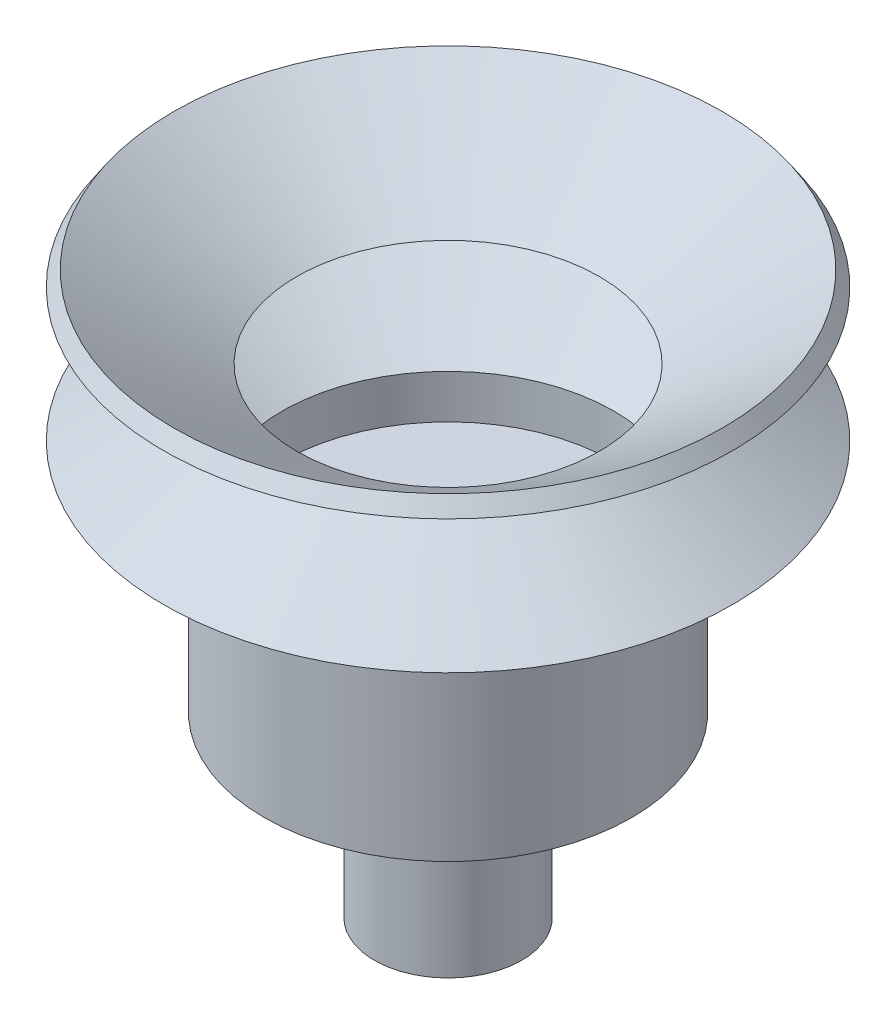
ISO-10303-21;
HEADER;
FILE_DESCRIPTION(('STEP AP214'),'2;1');
FILE_NAME('part.step','',(''),(''),'','','');
FILE_SCHEMA(('AUTOMOTIVE_DESIGN { 1 0 10303 214 1 1 1 1 }'));
ENDSEC;
DATA;
#1=APPLICATION_CONTEXT('core data for automotive mechanical design processes');
#2=APPLICATION_PROTOCOL_DEFINITION('international standard','automotive_design',2000,#1);
#3=PRODUCT_CONTEXT('',#1,'mechanical');
#4=PRODUCT('Part','Part','',(#3));
#5=PRODUCT_RELATED_PRODUCT_CATEGORY('part','',(#4));
#6=PRODUCT_DEFINITION_FORMATION('','',#4);
#7=PRODUCT_DEFINITION_CONTEXT('part definition',#1,'design');
#8=PRODUCT_DEFINITION('design','',#6,#7);
#9=PRODUCT_DEFINITION_SHAPE('','',#8);
#10=(LENGTH_UNIT() NAMED_UNIT(*) SI_UNIT(.MILLI.,.METRE.));
#11=(NAMED_UNIT(*) PLANE_ANGLE_UNIT() SI_UNIT($,.RADIAN.));
#12=(NAMED_UNIT(*) SI_UNIT($,.STERADIAN.) SOLID_ANGLE_UNIT());
#13=UNCERTAINTY_MEASURE_WITH_UNIT(LENGTH_MEASURE(1.E-05),#10,'distance_accuracy_value','');
#14=(GEOMETRIC_REPRESENTATION_CONTEXT(3) GLOBAL_UNCERTAINTY_ASSIGNED_CONTEXT((#13)) GLOBAL_UNIT_ASSIGNED_CONTEXT((#10,
#11,#12)) REPRESENTATION_CONTEXT('',''));
#15=CARTESIAN_POINT('',(0.,0.,0.));
#16=DIRECTION('',(0.,0.,1.));
#17=DIRECTION('',(1.,0.,0.));
#18=AXIS2_PLACEMENT_3D('',#15,#16,#17);
#19=CARTESIAN_POINT('',(0.,0.,0.));
#20=DIRECTION('',(0.,-1.,0.));
#21=DIRECTION('',(0.,0.,-1.));
#22=AXIS2_PLACEMENT_3D('',#19,#20,#21);
#23=PLANE('',#22);
#24=CARTESIAN_POINT('',(0.,0.,0.));
#25=DIRECTION('',(0.,-1.,0.));
#26=DIRECTION('',(0.,0.,-1.));
#27=AXIS2_PLACEMENT_3D('',#24,#25,#26);
#28=CIRCLE('',#27,3.3);
#29=CARTESIAN_POINT('',(0.,0.,-3.3));
#30=VERTEX_POINT('',#29);
#31=EDGE_CURVE('E10',#30,#30,#28,.T.);
#32=ORIENTED_EDGE('',*,*,#31,.F.);
#33=EDGE_LOOP('',(#32));
#34=FACE_BOUND('',#33,.T.);
#35=CARTESIAN_POINT('',(0.,0.,0.));
#36=DIRECTION('',(0.,-1.,0.));
#37=DIRECTION('',(0.,0.,-1.));
#38=AXIS2_PLACEMENT_3D('',#35,#36,#37);
#39=CIRCLE('',#38,8.22712578724926);
#40=CARTESIAN_POINT('',(0.,0.,-8.22712578724926));
#41=VERTEX_POINT('',#40);
#42=EDGE_CURVE('E38',#41,#41,#39,.T.);
#43=ORIENTED_EDGE('',*,*,#42,.T.);
#44=EDGE_LOOP('',(#43));
#45=FACE_BOUND('',#44,.T.);
#46=ADVANCED_FACE('F35',(#34,#45),#23,.T.);
#47=CARTESIAN_POINT('',(0.,0.,0.));
#48=DIRECTION('',(0.,-1.,0.));
#49=DIRECTION('',(0.,0.,-1.));
#50=AXIS2_PLACEMENT_3D('',#47,#48,#49);
#51=CYLINDRICAL_SURFACE('',#50,8.22712578724926);
#52=CARTESIAN_POINT('',(0.,7.51998689008455,0.));
#53=DIRECTION('',(0.,-1.,0.));
#54=DIRECTION('',(0.,0.,-1.));
#55=AXIS2_PLACEMENT_3D('',#52,#53,#54);
#56=CIRCLE('',#55,8.22712578724926);
#57=CARTESIAN_POINT('',(0.,7.51998689008455,-8.22712578724926));
#58=VERTEX_POINT('',#57);
#59=EDGE_CURVE('E46',#58,#58,#56,.T.);
#60=ORIENTED_EDGE('',*,*,#59,.T.);
#61=EDGE_LOOP('',(#60));
#62=FACE_BOUND('',#61,.T.);
#63=ORIENTED_EDGE('',*,*,#42,.F.);
#64=EDGE_LOOP('',(#63));
#65=FACE_BOUND('',#64,.T.);
#66=ADVANCED_FACE('F76',(#62,#65),#51,.T.);
#67=CARTESIAN_POINT('',(0.,7.51998689008455,0.));
#68=DIRECTION('',(0.,1.,0.));
#69=DIRECTION('',(0.,0.,1.));
#70=AXIS2_PLACEMENT_3D('',#67,#68,#69);
#71=CONICAL_SURFACE('',#70,8.22712578724926,0.985110783337746);
#72=CARTESIAN_POINT('',(0.,10.5049492014044,0.));
#73=DIRECTION('',(0.,-1.,0.));
#74=DIRECTION('',(0.,0.,-1.));
#75=AXIS2_PLACEMENT_3D('',#72,#73,#74);
#76=CIRCLE('',#75,12.7271257872493);
#77=CARTESIAN_POINT('',(0.,10.5049492014044,-12.7271257872493));
#78=VERTEX_POINT('',#77);
#79=EDGE_CURVE('E71',#78,#78,#76,.T.);
#80=ORIENTED_EDGE('',*,*,#79,.T.);
#81=EDGE_LOOP('',(#80));
#82=FACE_BOUND('',#81,.T.);
#83=ORIENTED_EDGE('',*,*,#59,.F.);
#84=EDGE_LOOP('',(#83));
#85=FACE_BOUND('',#84,.T.);
#86=ADVANCED_FACE('F79',(#82,#85),#71,.T.);
#87=CARTESIAN_POINT('',(0.,10.5049492014044,0.));
#88=DIRECTION('',(0.,-1.,0.));
#89=DIRECTION('',(0.,0.,-1.));
#90=AXIS2_PLACEMENT_3D('',#87,#88,#89);
#91=CONICAL_SURFACE('',#90,12.7271257872493,0.985110783337745);
#92=CARTESIAN_POINT('',(0.,13.4899115127243,0.));
#93=DIRECTION('',(0.,-1.,0.));
#94=DIRECTION('',(0.,0.,-1.));
#95=AXIS2_PLACEMENT_3D('',#92,#93,#94);
#96=CIRCLE('',#95,8.22712578724927);
#97=CARTESIAN_POINT('',(0.,13.4899115127243,-8.22712578724927));
#98=VERTEX_POINT('',#97);
#99=EDGE_CURVE('E68',#98,#98,#96,.T.);
#100=ORIENTED_EDGE('',*,*,#99,.T.);
#101=EDGE_LOOP('',(#100));
#102=FACE_BOUND('',#101,.T.);
#103=ORIENTED_EDGE('',*,*,#79,.F.);
#104=EDGE_LOOP('',(#103));
#105=FACE_BOUND('',#104,.T.);
#106=ADVANCED_FACE('F81',(#102,#105),#91,.T.);
#107=CARTESIAN_POINT('',(0.,13.4899115127243,0.));
#108=DIRECTION('',(0.,1.,0.));
#109=DIRECTION('',(0.,0.,1.));
#110=AXIS2_PLACEMENT_3D('',#107,#108,#109);
#111=CONICAL_SURFACE('',#110,8.22712578724927,0.985110783337747);
#112=CARTESIAN_POINT('',(0.,16.4748738240441,0.));
#113=DIRECTION('',(0.,-1.,0.));
#114=DIRECTION('',(0.,0.,-1.));
#115=AXIS2_PLACEMENT_3D('',#112,#113,#114);
#116=CIRCLE('',#115,12.7271257872493);
#117=CARTESIAN_POINT('',(0.,16.4748738240441,-12.7271257872493));
#118=VERTEX_POINT('',#117);
#119=EDGE_CURVE('E65',#118,#118,#116,.T.);
#120=ORIENTED_EDGE('',*,*,#119,.T.);
#121=EDGE_LOOP('',(#120));
#122=FACE_BOUND('',#121,.T.);
#123=ORIENTED_EDGE('',*,*,#99,.F.);
#124=EDGE_LOOP('',(#123));
#125=FACE_BOUND('',#124,.T.);
#126=ADVANCED_FACE('F88',(#122,#125),#111,.T.);
#127=CARTESIAN_POINT('',(0.,16.4748738240441,0.));
#128=DIRECTION('',(0.,-1.,0.));
#129=DIRECTION('',(0.,0.,-1.));
#130=AXIS2_PLACEMENT_3D('',#127,#128,#129);
#131=CONICAL_SURFACE('',#130,12.7271257872493,0.585685543457154);
#132=CARTESIAN_POINT('',(0.,17.1415404907108,0.));
#133=DIRECTION('',(0.,-1.,0.));
#134=DIRECTION('',(0.,0.,-1.));
#135=AXIS2_PLACEMENT_3D('',#132,#133,#134);
#136=CIRCLE('',#135,12.2849091485352);
#137=CARTESIAN_POINT('',(0.,17.1415404907108,-12.2849091485352));
#138=VERTEX_POINT('',#137);
#139=EDGE_CURVE('E62',#138,#138,#136,.T.);
#140=ORIENTED_EDGE('',*,*,#139,.T.);
#141=EDGE_LOOP('',(#140));
#142=FACE_BOUND('',#141,.T.);
#143=ORIENTED_EDGE('',*,*,#119,.F.);
#144=EDGE_LOOP('',(#143));
#145=FACE_BOUND('',#144,.T.);
#146=ADVANCED_FACE('F125',(#142,#145),#131,.T.);
#147=CARTESIAN_POINT('',(0.,17.1415404907108,0.));
#148=DIRECTION('',(0.,1.,0.));
#149=DIRECTION('',(0.,0.,1.));
#150=AXIS2_PLACEMENT_3D('',#147,#148,#149);
#151=CONICAL_SURFACE('',#150,12.2849091485352,0.985110783337743);
#152=CARTESIAN_POINT('',(0.,13.4899115127243,0.));
#153=DIRECTION('',(0.,-1.,0.));
#154=DIRECTION('',(0.,0.,-1.));
#155=AXIS2_PLACEMENT_3D('',#152,#153,#154);
#156=CIRCLE('',#155,6.779871333276);
#157=CARTESIAN_POINT('',(0.,13.4899115127243,-6.779871333276));
#158=VERTEX_POINT('',#157);
#159=EDGE_CURVE('E59',#158,#158,#156,.T.);
#160=ORIENTED_EDGE('',*,*,#159,.T.);
#161=EDGE_LOOP('',(#160));
#162=FACE_BOUND('',#161,.T.);
#163=ORIENTED_EDGE('',*,*,#139,.F.);
#164=EDGE_LOOP('',(#163));
#165=FACE_BOUND('',#164,.T.);
#166=ADVANCED_FACE('F136',(#162,#165),#151,.F.);
#167=CARTESIAN_POINT('',(0.,13.4899115127243,0.));
#168=DIRECTION('',(0.,-1.,0.));
#169=DIRECTION('',(0.,0.,-1.));
#170=AXIS2_PLACEMENT_3D('',#167,#168,#169);
#171=CONICAL_SURFACE('',#170,6.779871333276,0.985110783337746);
#172=CARTESIAN_POINT('',(0.,10.5049492014044,0.));
#173=DIRECTION('',(0.,-1.,0.));
#174=DIRECTION('',(0.,0.,-1.));
#175=AXIS2_PLACEMENT_3D('',#172,#173,#174);
#176=CIRCLE('',#175,11.279871333276);
#177=CARTESIAN_POINT('',(0.,10.5049492014044,-11.279871333276));
#178=VERTEX_POINT('',#177);
#179=EDGE_CURVE('E56',#178,#178,#176,.T.);
#180=ORIENTED_EDGE('',*,*,#179,.T.);
#181=EDGE_LOOP('',(#180));
#182=FACE_BOUND('',#181,.T.);
#183=ORIENTED_EDGE('',*,*,#159,.F.);
#184=EDGE_LOOP('',(#183));
#185=FACE_BOUND('',#184,.T.);
#186=ADVANCED_FACE('F147',(#182,#185),#171,.F.);
#187=CARTESIAN_POINT('',(0.,10.5049492014044,0.));
#188=DIRECTION('',(0.,1.,0.));
#189=DIRECTION('',(0.,0.,1.));
#190=AXIS2_PLACEMENT_3D('',#187,#188,#189);
#191=CONICAL_SURFACE('',#190,11.279871333276,0.985110783337743);
#192=CARTESIAN_POINT('',(0.,7.94932692362767,0.));
#193=DIRECTION('',(0.,-1.,0.));
#194=DIRECTION('',(0.,0.,-1.));
#195=AXIS2_PLACEMENT_3D('',#192,#193,#194);
#196=CIRCLE('',#195,7.42712578724926);
#197=CARTESIAN_POINT('',(0.,7.94932692362767,-7.42712578724926));
#198=VERTEX_POINT('',#197);
#199=EDGE_CURVE('E53',#198,#198,#196,.T.);
#200=ORIENTED_EDGE('',*,*,#199,.T.);
#201=EDGE_LOOP('',(#200));
#202=FACE_BOUND('',#201,.T.);
#203=ORIENTED_EDGE('',*,*,#179,.F.);
#204=EDGE_LOOP('',(#203));
#205=FACE_BOUND('',#204,.T.);
#206=ADVANCED_FACE('F158',(#202,#205),#191,.F.);
#207=CARTESIAN_POINT('',(0.,0.,0.));
#208=DIRECTION('',(0.,-1.,0.));
#209=DIRECTION('',(0.,0.,-1.));
#210=AXIS2_PLACEMENT_3D('',#207,#208,#209);
#211=CYLINDRICAL_SURFACE('',#210,7.42712578724926);
#212=CARTESIAN_POINT('',(0.,5.98991151272425,0.));
#213=DIRECTION('',(0.,-1.,0.));
#214=DIRECTION('',(0.,0.,-1.));
#215=AXIS2_PLACEMENT_3D('',#212,#213,#214);
#216=CIRCLE('',#215,7.42712578724926);
#217=CARTESIAN_POINT('',(0.,5.98991151272425,-7.42712578724926));
#218=VERTEX_POINT('',#217);
#219=EDGE_CURVE('E50',#218,#218,#216,.T.);
#220=ORIENTED_EDGE('',*,*,#219,.T.);
#221=EDGE_LOOP('',(#220));
#222=FACE_BOUND('',#221,.T.);
#223=ORIENTED_EDGE('',*,*,#199,.F.);
#224=EDGE_LOOP('',(#223));
#225=FACE_BOUND('',#224,.T.);
#226=ADVANCED_FACE('F169',(#222,#225),#211,.F.);
#227=CARTESIAN_POINT('',(7.42712578724926,5.98991151272425,0.));
#228=DIRECTION('',(0.,1.,0.));
#229=DIRECTION('',(0.,0.,1.));
#230=AXIS2_PLACEMENT_3D('',#227,#228,#229);
#231=PLANE('',#230);
#232=ORIENTED_EDGE('',*,*,#219,.F.);
#233=EDGE_LOOP('',(#232));
#234=FACE_BOUND('',#233,.T.);
#235=ADVANCED_FACE('F179',(#234),#231,.T.);
#236=CARTESIAN_POINT('',(0.,-8.,0.));
#237=DIRECTION('',(0.,1.,0.));
#238=DIRECTION('',(0.,0.,1.));
#239=AXIS2_PLACEMENT_3D('',#236,#237,#238);
#240=CYLINDRICAL_SURFACE('',#239,3.3);
#241=CARTESIAN_POINT('',(0.,-8.,0.));
#242=DIRECTION('',(0.,-1.,0.));
#243=DIRECTION('',(0.,0.,-1.));
#244=AXIS2_PLACEMENT_3D('',#241,#242,#243);
#245=CIRCLE('',#244,3.3);
#246=CARTESIAN_POINT('',(0.,-8.,-3.3));
#247=VERTEX_POINT('',#246);
#248=EDGE_CURVE('E49',#247,#247,#245,.T.);
#249=ORIENTED_EDGE('',*,*,#248,.F.);
#250=EDGE_LOOP('',(#249));
#251=FACE_BOUND('',#250,.T.);
#252=ORIENTED_EDGE('',*,*,#31,.T.);
#253=EDGE_LOOP('',(#252));
#254=FACE_BOUND('',#253,.T.);
#255=ADVANCED_FACE('F189',(#251,#254),#240,.T.);
#256=CARTESIAN_POINT('',(0.,-8.,0.));
#257=DIRECTION('',(0.,-1.,0.));
#258=DIRECTION('',(0.,0.,-1.));
#259=AXIS2_PLACEMENT_3D('',#256,#257,#258);
#260=PLANE('',#259);
#261=ORIENTED_EDGE('',*,*,#248,.T.);
#262=EDGE_LOOP('',(#261));
#263=FACE_BOUND('',#262,.T.);
#264=ADVANCED_FACE('F200',(#263),#260,.T.);
#265=CLOSED_SHELL('',(#46,#66,#86,#106,#126,#146,#166,#186,#206,#226,#235,#255,#264));
#266=MANIFOLD_SOLID_BREP('B2',#265);
#267=ADVANCED_BREP_SHAPE_REPRESENTATION('',(#18,#266),#14);
#268=SHAPE_DEFINITION_REPRESENTATION(#9,#267);
ENDSEC;
END-ISO-10303-21;
